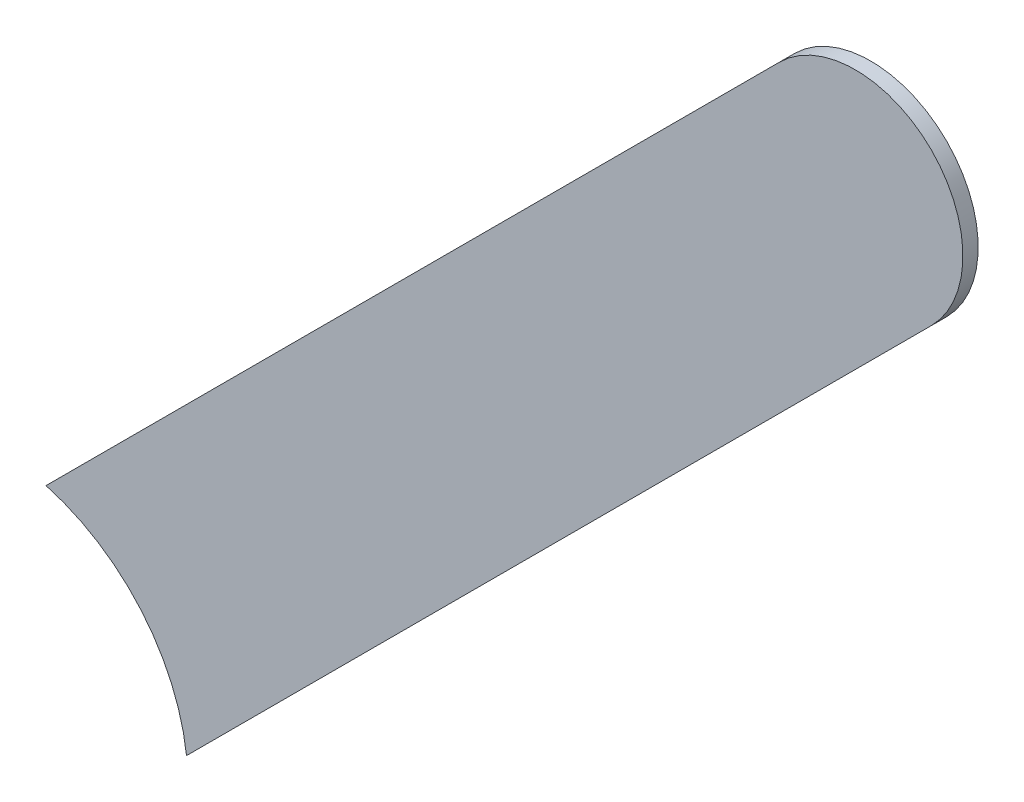
ISO-10303-21;
HEADER;
FILE_DESCRIPTION(('STEP AP214'),'2;1');
FILE_NAME('part.step','',(''),(''),'','','');
FILE_SCHEMA(('AUTOMOTIVE_DESIGN { 1 0 10303 214 1 1 1 1 }'));
ENDSEC;
DATA;
#1=APPLICATION_CONTEXT('core data for automotive mechanical design processes');
#2=APPLICATION_PROTOCOL_DEFINITION('international standard','automotive_design',2000,#1);
#3=PRODUCT_CONTEXT('',#1,'mechanical');
#4=PRODUCT('Part','Part','',(#3));
#5=PRODUCT_RELATED_PRODUCT_CATEGORY('part','',(#4));
#6=PRODUCT_DEFINITION_FORMATION('','',#4);
#7=PRODUCT_DEFINITION_CONTEXT('part definition',#1,'design');
#8=PRODUCT_DEFINITION('design','',#6,#7);
#9=PRODUCT_DEFINITION_SHAPE('','',#8);
#10=(LENGTH_UNIT() NAMED_UNIT(*) SI_UNIT(.MILLI.,.METRE.));
#11=(NAMED_UNIT(*) PLANE_ANGLE_UNIT() SI_UNIT($,.RADIAN.));
#12=(NAMED_UNIT(*) SI_UNIT($,.STERADIAN.) SOLID_ANGLE_UNIT());
#13=UNCERTAINTY_MEASURE_WITH_UNIT(LENGTH_MEASURE(1.E-05),#10,'distance_accuracy_value','');
#14=(GEOMETRIC_REPRESENTATION_CONTEXT(3) GLOBAL_UNCERTAINTY_ASSIGNED_CONTEXT((#13)) GLOBAL_UNIT_ASSIGNED_CONTEXT((#10,
#11,#12)) REPRESENTATION_CONTEXT('',''));
#15=CARTESIAN_POINT('',(0.,0.,0.));
#16=DIRECTION('',(0.,0.,1.));
#17=DIRECTION('',(1.,0.,0.));
#18=AXIS2_PLACEMENT_3D('',#15,#16,#17);
#19=CARTESIAN_POINT('',(39.8468338780605,98.5932797580605,0.));
#20=DIRECTION('',(-0.707106781186545,0.70710678118655,0.));
#21=DIRECTION('',(0.70710678118655,0.707106781186545,0.));
#22=AXIS2_PLACEMENT_3D('',#19,#20,#21);
#23=PLANE('',#22);
#24=DIRECTION('',(0.70710678118655,0.707106781186545,0.));
#25=VECTOR('',#24,1.);
#26=CARTESIAN_POINT('',(39.61677878,98.36322466,0.03556));
#27=LINE('',#26,#25);
#28=CARTESIAN_POINT('',(39.8468338780605,98.5932797580605,0.03556));
#29=VERTEX_POINT('',#28);
#30=CARTESIAN_POINT('',(41.57878908,100.32523496,0.03556));
#31=VERTEX_POINT('',#30);
#32=EDGE_CURVE('E11',#29,#31,#27,.T.);
#33=ORIENTED_EDGE('',*,*,#32,.F.);
#34=DIRECTION('',(0.,0.,1.));
#35=VECTOR('',#34,1.);
#36=CARTESIAN_POINT('',(39.8468338780605,98.5932797580605,0.));
#37=LINE('',#36,#35);
#38=CARTESIAN_POINT('',(39.8468338780605,98.5932797580605,0.));
#39=VERTEX_POINT('',#38);
#40=EDGE_CURVE('E24',#39,#29,#37,.T.);
#41=ORIENTED_EDGE('',*,*,#40,.F.);
#42=DIRECTION('',(0.70710678118655,0.707106781186545,0.));
#43=VECTOR('',#42,1.);
#44=CARTESIAN_POINT('',(39.61677878,98.36322466,0.));
#45=LINE('',#44,#43);
#46=CARTESIAN_POINT('',(41.57878908,100.32523496,0.));
#47=VERTEX_POINT('',#46);
#48=EDGE_CURVE('E75',#39,#47,#45,.T.);
#49=ORIENTED_EDGE('',*,*,#48,.T.);
#50=DIRECTION('',(0.,0.,1.));
#51=VECTOR('',#50,1.);
#52=CARTESIAN_POINT('',(41.57878908,100.32523496,0.));
#53=LINE('',#52,#51);
#54=EDGE_CURVE('E37',#47,#31,#53,.T.);
#55=ORIENTED_EDGE('',*,*,#54,.T.);
#56=EDGE_LOOP('',(#33,#41,#49,#55));
#57=FACE_BOUND('',#56,.T.);
#58=ADVANCED_FACE('F17',(#57),#23,.F.);
#59=CARTESIAN_POINT('',(41.4020127,100.50201134,0.));
#60=DIRECTION('',(0.,0.,-1.));
#61=DIRECTION('',(0.707106781186533,-0.707106781186562,0.));
#62=AXIS2_PLACEMENT_3D('',#59,#60,#61);
#63=CYLINDRICAL_SURFACE('',#62,0.249999554103226);
#64=CARTESIAN_POINT('',(41.4020127,100.50201134,0.03556));
#65=DIRECTION('',(0.,0.,1.));
#66=DIRECTION('',(0.707106781186533,-0.707106781186562,0.));
#67=AXIS2_PLACEMENT_3D('',#64,#65,#66);
#68=CIRCLE('',#67,0.249999554103226);
#69=CARTESIAN_POINT('',(41.22523632,100.67878772,0.03556));
#70=VERTEX_POINT('',#69);
#71=EDGE_CURVE('E83',#31,#70,#68,.T.);
#72=ORIENTED_EDGE('',*,*,#71,.F.);
#73=ORIENTED_EDGE('',*,*,#54,.F.);
#74=CARTESIAN_POINT('',(41.4020127,100.50201134,0.));
#75=DIRECTION('',(0.,0.,1.));
#76=DIRECTION('',(0.707106781186533,-0.707106781186562,0.));
#77=AXIS2_PLACEMENT_3D('',#74,#75,#76);
#78=CIRCLE('',#77,0.249999554103226);
#79=CARTESIAN_POINT('',(41.22523632,100.67878772,0.));
#80=VERTEX_POINT('',#79);
#81=EDGE_CURVE('E81',#47,#80,#78,.T.);
#82=ORIENTED_EDGE('',*,*,#81,.T.);
#83=DIRECTION('',(0.,0.,1.));
#84=VECTOR('',#83,1.);
#85=CARTESIAN_POINT('',(41.22523632,100.67878772,0.));
#86=LINE('',#85,#84);
#87=EDGE_CURVE('E67',#80,#70,#86,.T.);
#88=ORIENTED_EDGE('',*,*,#87,.T.);
#89=EDGE_LOOP('',(#72,#73,#82,#88));
#90=FACE_BOUND('',#89,.T.);
#91=ADVANCED_FACE('F89',(#90),#63,.T.);
#92=CARTESIAN_POINT('',(41.22523632,100.67878772,0.));
#93=DIRECTION('',(0.707106781186549,-0.707106781186546,0.));
#94=DIRECTION('',(-0.707106781186546,-0.707106781186549,0.));
#95=AXIS2_PLACEMENT_3D('',#92,#93,#94);
#96=PLANE('',#95);
#97=DIRECTION('',(-0.707106781186546,-0.707106781186549,0.));
#98=VECTOR('',#97,1.);
#99=CARTESIAN_POINT('',(41.22523632,100.67878772,0.03556));
#100=LINE('',#99,#98);
#101=CARTESIAN_POINT('',(39.5201203431295,98.9736717431295,0.03556));
#102=VERTEX_POINT('',#101);
#103=EDGE_CURVE('E71',#70,#102,#100,.T.);
#104=ORIENTED_EDGE('',*,*,#103,.F.);
#105=ORIENTED_EDGE('',*,*,#87,.F.);
#106=DIRECTION('',(-0.707106781186546,-0.707106781186549,0.));
#107=VECTOR('',#106,1.);
#108=CARTESIAN_POINT('',(41.22523632,100.67878772,0.));
#109=LINE('',#108,#107);
#110=CARTESIAN_POINT('',(39.5201203431295,98.9736717431295,0.));
#111=VERTEX_POINT('',#110);
#112=EDGE_CURVE('E63',#80,#111,#109,.T.);
#113=ORIENTED_EDGE('',*,*,#112,.T.);
#114=DIRECTION('',(0.,0.,1.));
#115=VECTOR('',#114,1.);
#116=CARTESIAN_POINT('',(39.5201203431295,98.9736717431295,0.));
#117=LINE('',#116,#115);
#118=EDGE_CURVE('E53',#111,#102,#117,.T.);
#119=ORIENTED_EDGE('',*,*,#118,.T.);
#120=EDGE_LOOP('',(#104,#105,#113,#119));
#121=FACE_BOUND('',#120,.T.);
#122=ADVANCED_FACE('F66',(#121),#96,.F.);
#123=CARTESIAN_POINT('',(39.39999994,98.54000104,0.));
#124=DIRECTION('',(0.,0.,-1.));
#125=DIRECTION('',(1.,0.,0.));
#126=AXIS2_PLACEMENT_3D('',#123,#124,#125);
#127=CYLINDRICAL_SURFACE('',#126,0.4499991);
#128=ORIENTED_EDGE('',*,*,#40,.T.);
#129=CARTESIAN_POINT('',(39.39999994,98.54000104,0.03556));
#130=DIRECTION('',(0.,0.,1.));
#131=DIRECTION('',(1.,0.,0.));
#132=AXIS2_PLACEMENT_3D('',#129,#130,#131);
#133=CIRCLE('',#132,0.4499991);
#134=EDGE_CURVE('E59',#29,#102,#133,.T.);
#135=ORIENTED_EDGE('',*,*,#134,.T.);
#136=ORIENTED_EDGE('',*,*,#118,.F.);
#137=CARTESIAN_POINT('',(39.39999994,98.54000104,0.));
#138=DIRECTION('',(0.,0.,1.));
#139=DIRECTION('',(1.,0.,0.));
#140=AXIS2_PLACEMENT_3D('',#137,#138,#139);
#141=CIRCLE('',#140,0.4499991);
#142=EDGE_CURVE('E57',#39,#111,#141,.T.);
#143=ORIENTED_EDGE('',*,*,#142,.F.);
#144=EDGE_LOOP('',(#128,#135,#136,#143));
#145=FACE_BOUND('',#144,.T.);
#146=ADVANCED_FACE('F55',(#145),#127,.F.);
#147=CARTESIAN_POINT('',(39.61677878,98.36322466,0.));
#148=DIRECTION('',(0.,0.,-1.));
#149=DIRECTION('',(-1.,0.,0.));
#150=AXIS2_PLACEMENT_3D('',#147,#148,#149);
#151=PLANE('',#150);
#152=ORIENTED_EDGE('',*,*,#48,.F.);
#153=ORIENTED_EDGE('',*,*,#142,.T.);
#154=ORIENTED_EDGE('',*,*,#112,.F.);
#155=ORIENTED_EDGE('',*,*,#81,.F.);
#156=EDGE_LOOP('',(#152,#153,#154,#155));
#157=FACE_BOUND('',#156,.T.);
#158=ADVANCED_FACE('F74',(#157),#151,.T.);
#159=CARTESIAN_POINT('',(39.61677878,98.36322466,0.03556));
#160=DIRECTION('',(0.,0.,-1.));
#161=DIRECTION('',(-1.,0.,0.));
#162=AXIS2_PLACEMENT_3D('',#159,#160,#161);
#163=PLANE('',#162);
#164=ORIENTED_EDGE('',*,*,#134,.F.);
#165=ORIENTED_EDGE('',*,*,#32,.T.);
#166=ORIENTED_EDGE('',*,*,#71,.T.);
#167=ORIENTED_EDGE('',*,*,#103,.T.);
#168=EDGE_LOOP('',(#164,#165,#166,#167));
#169=FACE_BOUND('',#168,.T.);
#170=ADVANCED_FACE('F91',(#169),#163,.F.);
#171=CLOSED_SHELL('',(#58,#91,#122,#146,#158,#170));
#172=MANIFOLD_SOLID_BREP('B1',#171);
#173=ADVANCED_BREP_SHAPE_REPRESENTATION('',(#18,#172),#14);
#174=SHAPE_DEFINITION_REPRESENTATION(#9,#173);
ENDSEC;
END-ISO-10303-21;
